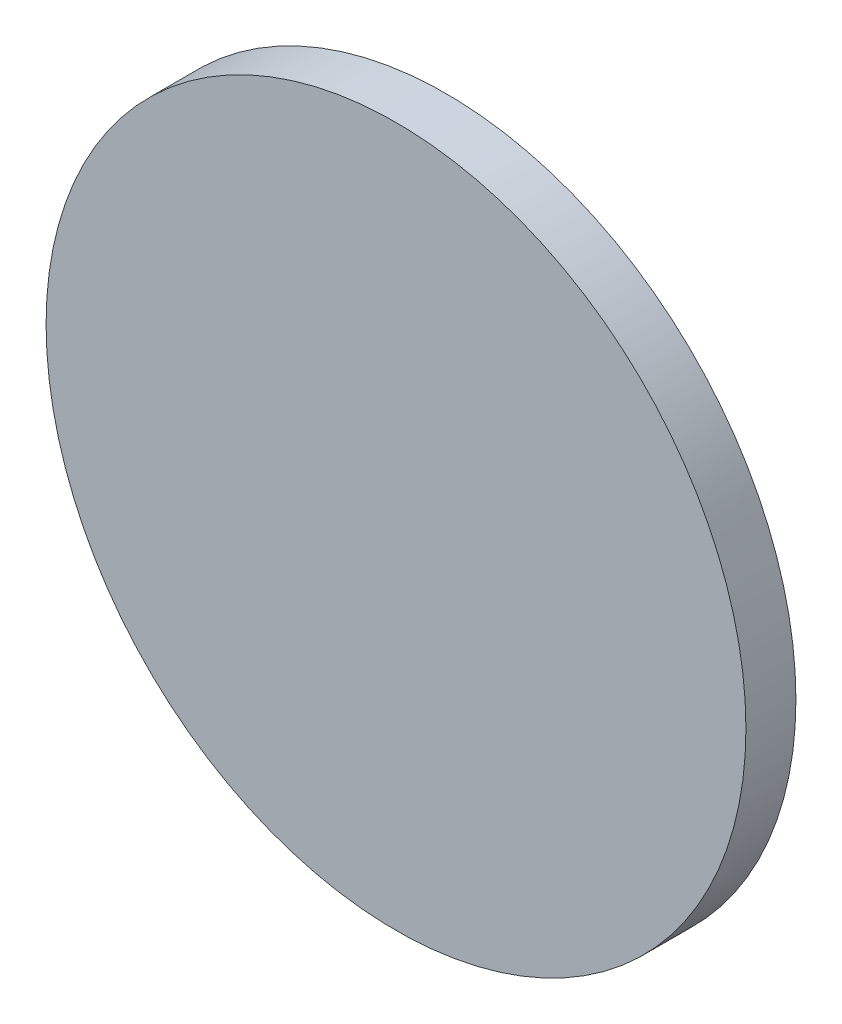
ISO-10303-21;
HEADER;
FILE_DESCRIPTION(('STEP AP214'),'2;1');
FILE_NAME('part.step','',(''),(''),'','','');
FILE_SCHEMA(('AUTOMOTIVE_DESIGN { 1 0 10303 214 1 1 1 1 }'));
ENDSEC;
DATA;
#1=APPLICATION_CONTEXT('core data for automotive mechanical design processes');
#2=APPLICATION_PROTOCOL_DEFINITION('international standard','automotive_design',2000,#1);
#3=PRODUCT_CONTEXT('',#1,'mechanical');
#4=PRODUCT('Part','Part','',(#3));
#5=PRODUCT_RELATED_PRODUCT_CATEGORY('part','',(#4));
#6=PRODUCT_DEFINITION_FORMATION('','',#4);
#7=PRODUCT_DEFINITION_CONTEXT('part definition',#1,'design');
#8=PRODUCT_DEFINITION('design','',#6,#7);
#9=PRODUCT_DEFINITION_SHAPE('','',#8);
#10=(LENGTH_UNIT() NAMED_UNIT(*) SI_UNIT(.MILLI.,.METRE.));
#11=(NAMED_UNIT(*) PLANE_ANGLE_UNIT() SI_UNIT($,.RADIAN.));
#12=(NAMED_UNIT(*) SI_UNIT($,.STERADIAN.) SOLID_ANGLE_UNIT());
#13=UNCERTAINTY_MEASURE_WITH_UNIT(LENGTH_MEASURE(1.E-05),#10,'distance_accuracy_value','');
#14=(GEOMETRIC_REPRESENTATION_CONTEXT(3) GLOBAL_UNCERTAINTY_ASSIGNED_CONTEXT((#13)) GLOBAL_UNIT_ASSIGNED_CONTEXT((#10,
#11,#12)) REPRESENTATION_CONTEXT('',''));
#15=CARTESIAN_POINT('',(0.,0.,0.));
#16=DIRECTION('',(0.,0.,1.));
#17=DIRECTION('',(1.,0.,0.));
#18=AXIS2_PLACEMENT_3D('',#15,#16,#17);
#19=CARTESIAN_POINT('',(0.,0.,1.));
#20=DIRECTION('',(0.,0.,-1.));
#21=DIRECTION('',(-1.,0.,0.));
#22=AXIS2_PLACEMENT_3D('',#19,#20,#21);
#23=CYLINDRICAL_SURFACE('',#22,7.);
#24=CARTESIAN_POINT('',(0.,0.,1.));
#25=DIRECTION('',(0.,0.,1.));
#26=DIRECTION('',(1.,0.,0.));
#27=AXIS2_PLACEMENT_3D('',#24,#25,#26);
#28=CIRCLE('',#27,7.);
#29=CARTESIAN_POINT('',(7.,0.,1.));
#30=VERTEX_POINT('',#29);
#31=EDGE_CURVE('E10',#30,#30,#28,.T.);
#32=ORIENTED_EDGE('',*,*,#31,.F.);
#33=EDGE_LOOP('',(#32));
#34=FACE_BOUND('',#33,.T.);
#35=CARTESIAN_POINT('',(0.,0.,0.));
#36=DIRECTION('',(0.,0.,1.));
#37=DIRECTION('',(1.,0.,0.));
#38=AXIS2_PLACEMENT_3D('',#35,#36,#37);
#39=CIRCLE('',#38,7.);
#40=CARTESIAN_POINT('',(7.,0.,0.));
#41=VERTEX_POINT('',#40);
#42=EDGE_CURVE('E34',#41,#41,#39,.T.);
#43=ORIENTED_EDGE('',*,*,#42,.T.);
#44=EDGE_LOOP('',(#43));
#45=FACE_BOUND('',#44,.T.);
#46=ADVANCED_FACE('F31',(#34,#45),#23,.T.);
#47=CARTESIAN_POINT('',(0.,0.,1.));
#48=DIRECTION('',(0.,0.,1.));
#49=DIRECTION('',(1.,0.,0.));
#50=AXIS2_PLACEMENT_3D('',#47,#48,#49);
#51=PLANE('',#50);
#52=ORIENTED_EDGE('',*,*,#31,.T.);
#53=EDGE_LOOP('',(#52));
#54=FACE_BOUND('',#53,.T.);
#55=ADVANCED_FACE('F46',(#54),#51,.T.);
#56=CARTESIAN_POINT('',(0.,0.,0.));
#57=DIRECTION('',(0.,0.,1.));
#58=DIRECTION('',(1.,0.,0.));
#59=AXIS2_PLACEMENT_3D('',#56,#57,#58);
#60=PLANE('',#59);
#61=ORIENTED_EDGE('',*,*,#42,.F.);
#62=EDGE_LOOP('',(#61));
#63=FACE_BOUND('',#62,.T.);
#64=ADVANCED_FACE('F44',(#63),#60,.F.);
#65=CLOSED_SHELL('',(#46,#55,#64));
#66=MANIFOLD_SOLID_BREP('B2',#65);
#67=ADVANCED_BREP_SHAPE_REPRESENTATION('',(#18,#66),#14);
#68=SHAPE_DEFINITION_REPRESENTATION(#9,#67);
ENDSEC;
END-ISO-10303-21;
